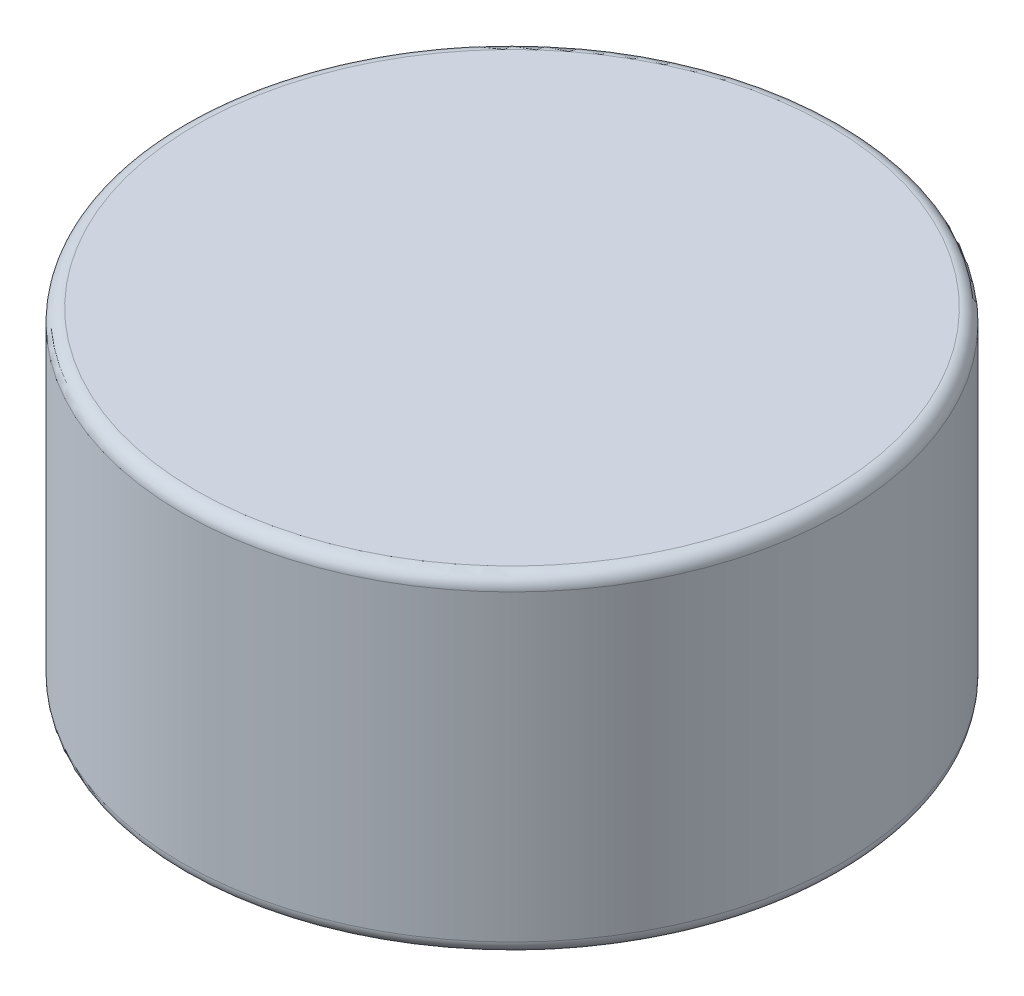
ISO-10303-21;
HEADER;
FILE_DESCRIPTION(('STEP AP214'),'2;1');
FILE_NAME('part.step','',(''),(''),'','','');
FILE_SCHEMA(('AUTOMOTIVE_DESIGN { 1 0 10303 214 1 1 1 1 }'));
ENDSEC;
DATA;
#1=APPLICATION_CONTEXT('core data for automotive mechanical design processes');
#2=APPLICATION_PROTOCOL_DEFINITION('international standard','automotive_design',2000,#1);
#3=PRODUCT_CONTEXT('',#1,'mechanical');
#4=PRODUCT('Part','Part','',(#3));
#5=PRODUCT_RELATED_PRODUCT_CATEGORY('part','',(#4));
#6=PRODUCT_DEFINITION_FORMATION('','',#4);
#7=PRODUCT_DEFINITION_CONTEXT('part definition',#1,'design');
#8=PRODUCT_DEFINITION('design','',#6,#7);
#9=PRODUCT_DEFINITION_SHAPE('','',#8);
#10=(LENGTH_UNIT() NAMED_UNIT(*) SI_UNIT(.MILLI.,.METRE.));
#11=(NAMED_UNIT(*) PLANE_ANGLE_UNIT() SI_UNIT($,.RADIAN.));
#12=(NAMED_UNIT(*) SI_UNIT($,.STERADIAN.) SOLID_ANGLE_UNIT());
#13=UNCERTAINTY_MEASURE_WITH_UNIT(LENGTH_MEASURE(1.E-05),#10,'distance_accuracy_value','');
#14=(GEOMETRIC_REPRESENTATION_CONTEXT(3) GLOBAL_UNCERTAINTY_ASSIGNED_CONTEXT((#13)) GLOBAL_UNIT_ASSIGNED_CONTEXT((#10,
#11,#12)) REPRESENTATION_CONTEXT('',''));
#15=CARTESIAN_POINT('',(0.,0.,0.));
#16=DIRECTION('',(0.,0.,1.));
#17=DIRECTION('',(1.,0.,0.));
#18=AXIS2_PLACEMENT_3D('',#15,#16,#17);
#19=CARTESIAN_POINT('',(0.,1.5875,0.));
#20=DIRECTION('',(0.,-1.,0.));
#21=DIRECTION('',(0.,0.,-1.));
#22=AXIS2_PLACEMENT_3D('',#19,#20,#21);
#23=CYLINDRICAL_SURFACE('',#22,3.175);
#24=CARTESIAN_POINT('',(0.,-1.4605,0.));
#25=DIRECTION('',(0.,1.,0.));
#26=DIRECTION('',(0.,0.,1.));
#27=AXIS2_PLACEMENT_3D('',#24,#25,#26);
#28=CIRCLE('',#27,3.175);
#29=CARTESIAN_POINT('',(0.,-1.4605,3.175));
#30=VERTEX_POINT('',#29);
#31=EDGE_CURVE('E49',#30,#30,#28,.T.);
#32=ORIENTED_EDGE('',*,*,#31,.T.);
#33=EDGE_LOOP('',(#32));
#34=FACE_BOUND('',#33,.T.);
#35=CARTESIAN_POINT('',(0.,1.4605,0.));
#36=DIRECTION('',(0.,1.,0.));
#37=DIRECTION('',(0.,0.,1.));
#38=AXIS2_PLACEMENT_3D('',#35,#36,#37);
#39=CIRCLE('',#38,3.175);
#40=CARTESIAN_POINT('',(0.,1.4605,3.175));
#41=VERTEX_POINT('',#40);
#42=EDGE_CURVE('E53',#41,#41,#39,.F.);
#43=ORIENTED_EDGE('',*,*,#42,.T.);
#44=EDGE_LOOP('',(#43));
#45=FACE_BOUND('',#44,.T.);
#46=ADVANCED_FACE('F39',(#34,#45),#23,.T.);
#47=CARTESIAN_POINT('',(0.,1.5875,0.));
#48=DIRECTION('',(0.,1.,0.));
#49=DIRECTION('',(0.,0.,1.));
#50=AXIS2_PLACEMENT_3D('',#47,#48,#49);
#51=PLANE('',#50);
#52=CARTESIAN_POINT('',(0.,1.5875,0.));
#53=DIRECTION('',(0.,1.,0.));
#54=DIRECTION('',(0.,0.,1.));
#55=AXIS2_PLACEMENT_3D('',#52,#53,#54);
#56=CIRCLE('',#55,3.048);
#57=CARTESIAN_POINT('',(0.,1.5875,3.048));
#58=VERTEX_POINT('',#57);
#59=EDGE_CURVE('E10',#58,#58,#56,.T.);
#60=ORIENTED_EDGE('',*,*,#59,.T.);
#61=EDGE_LOOP('',(#60));
#62=FACE_BOUND('',#61,.T.);
#63=ADVANCED_FACE('F67',(#62),#51,.T.);
#64=CARTESIAN_POINT('',(0.,-1.5875,0.));
#65=DIRECTION('',(0.,1.,0.));
#66=DIRECTION('',(0.,0.,1.));
#67=AXIS2_PLACEMENT_3D('',#64,#65,#66);
#68=PLANE('',#67);
#69=CARTESIAN_POINT('',(0.,-1.5875,0.));
#70=DIRECTION('',(0.,1.,0.));
#71=DIRECTION('',(0.,0.,1.));
#72=AXIS2_PLACEMENT_3D('',#69,#70,#71);
#73=CIRCLE('',#72,3.048);
#74=CARTESIAN_POINT('',(0.,-1.5875,3.048));
#75=VERTEX_POINT('',#74);
#76=EDGE_CURVE('E46',#75,#75,#73,.F.);
#77=ORIENTED_EDGE('',*,*,#76,.T.);
#78=EDGE_LOOP('',(#77));
#79=FACE_BOUND('',#78,.T.);
#80=ADVANCED_FACE('F66',(#79),#68,.F.);
#81=CARTESIAN_POINT('',(0.,-1.4605,0.));
#82=DIRECTION('',(0.,1.,0.));
#83=DIRECTION('',(0.,0.,1.));
#84=AXIS2_PLACEMENT_3D('',#81,#82,#83);
#85=TOROIDAL_SURFACE('',#84,3.048,0.127);
#86=ORIENTED_EDGE('',*,*,#76,.F.);
#87=EDGE_LOOP('',(#86));
#88=FACE_BOUND('',#87,.T.);
#89=ORIENTED_EDGE('',*,*,#31,.F.);
#90=EDGE_LOOP('',(#89));
#91=FACE_BOUND('',#90,.T.);
#92=ADVANCED_FACE('F64',(#88,#91),#85,.T.);
#93=CARTESIAN_POINT('',(0.,1.4605,0.));
#94=DIRECTION('',(0.,1.,0.));
#95=DIRECTION('',(0.,0.,1.));
#96=AXIS2_PLACEMENT_3D('',#93,#94,#95);
#97=TOROIDAL_SURFACE('',#96,3.048,0.127);
#98=ORIENTED_EDGE('',*,*,#42,.F.);
#99=EDGE_LOOP('',(#98));
#100=FACE_BOUND('',#99,.T.);
#101=ORIENTED_EDGE('',*,*,#59,.F.);
#102=EDGE_LOOP('',(#101));
#103=FACE_BOUND('',#102,.T.);
#104=ADVANCED_FACE('F41',(#100,#103),#97,.T.);
#105=CLOSED_SHELL('',(#46,#63,#80,#92,#104));
#106=MANIFOLD_SOLID_BREP('B2',#105);
#107=ADVANCED_BREP_SHAPE_REPRESENTATION('',(#18,#106),#14);
#108=SHAPE_DEFINITION_REPRESENTATION(#9,#107);
ENDSEC;
END-ISO-10303-21;
